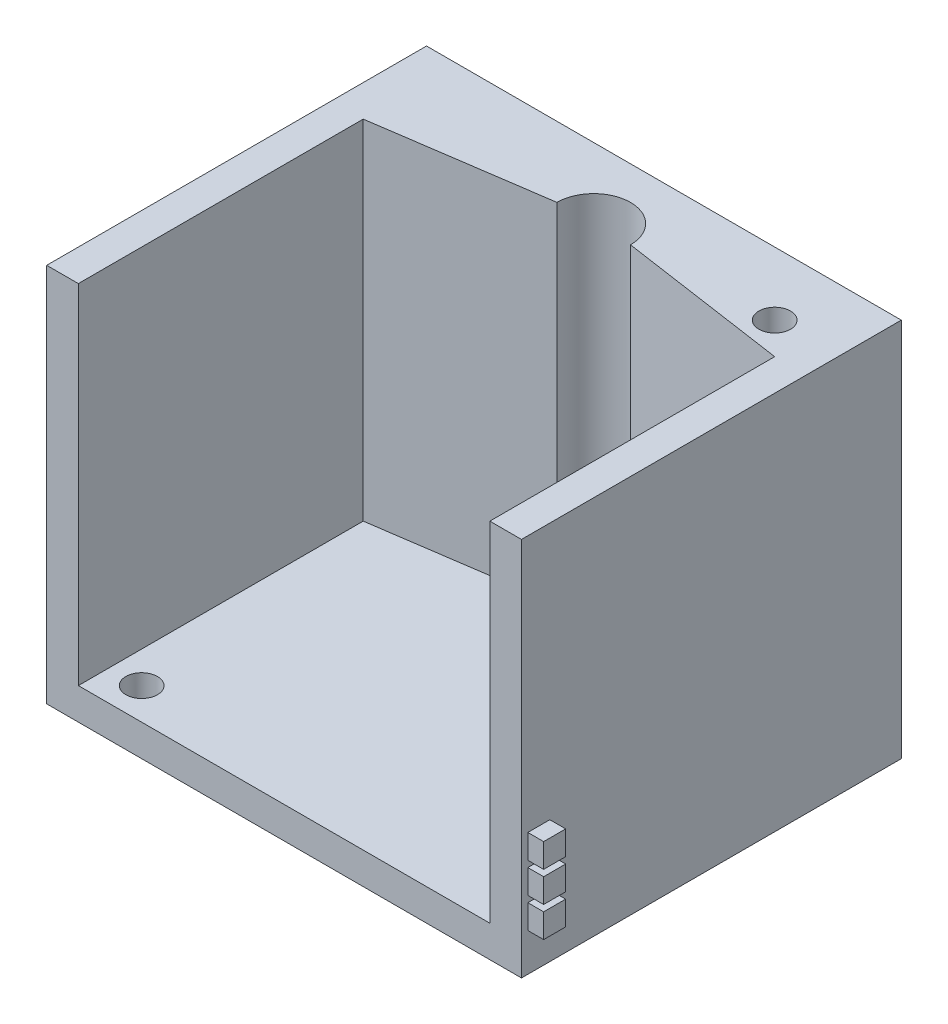
ISO-10303-21;
HEADER;
FILE_DESCRIPTION(('STEP AP214'),'2;1');
FILE_NAME('part.step','',(''),(''),'','','');
FILE_SCHEMA(('AUTOMOTIVE_DESIGN { 1 0 10303 214 1 1 1 1 }'));
ENDSEC;
DATA;
#1=APPLICATION_CONTEXT('core data for automotive mechanical design processes');
#2=APPLICATION_PROTOCOL_DEFINITION('international standard','automotive_design',2000,#1);
#3=PRODUCT_CONTEXT('',#1,'mechanical');
#4=PRODUCT('Part','Part','',(#3));
#5=PRODUCT_RELATED_PRODUCT_CATEGORY('part','',(#4));
#6=PRODUCT_DEFINITION_FORMATION('','',#4);
#7=PRODUCT_DEFINITION_CONTEXT('part definition',#1,'design');
#8=PRODUCT_DEFINITION('design','',#6,#7);
#9=PRODUCT_DEFINITION_SHAPE('','',#8);
#10=(LENGTH_UNIT() NAMED_UNIT(*) SI_UNIT(.MILLI.,.METRE.));
#11=(NAMED_UNIT(*) PLANE_ANGLE_UNIT() SI_UNIT($,.RADIAN.));
#12=(NAMED_UNIT(*) SI_UNIT($,.STERADIAN.) SOLID_ANGLE_UNIT());
#13=UNCERTAINTY_MEASURE_WITH_UNIT(LENGTH_MEASURE(1.E-05),#10,'distance_accuracy_value','');
#14=(GEOMETRIC_REPRESENTATION_CONTEXT(3) GLOBAL_UNCERTAINTY_ASSIGNED_CONTEXT((#13)) GLOBAL_UNIT_ASSIGNED_CONTEXT((#10,
#11,#12)) REPRESENTATION_CONTEXT('',''));
#15=CARTESIAN_POINT('',(0.,0.,0.));
#16=DIRECTION('',(0.,0.,1.));
#17=DIRECTION('',(1.,0.,0.));
#18=AXIS2_PLACEMENT_3D('',#15,#16,#17);
#19=CARTESIAN_POINT('',(150.,120.,0.));
#20=DIRECTION('',(-1.,0.,0.));
#21=DIRECTION('',(0.,0.,1.));
#22=AXIS2_PLACEMENT_3D('',#19,#20,#21);
#23=PLANE('',#22);
#24=DIRECTION('',(0.,-1.,0.));
#25=VECTOR('',#24,1.);
#26=CARTESIAN_POINT('',(150.,31.214997659939,-2.));
#27=LINE('',#26,#25);
#28=CARTESIAN_POINT('',(150.,38.8224964899084,-2.));
#29=VERTEX_POINT('',#28);
#30=CARTESIAN_POINT('',(150.,31.214997659939,-2.));
#31=VERTEX_POINT('',#30);
#32=EDGE_CURVE('E205',#29,#31,#27,.T.);
#33=ORIENTED_EDGE('',*,*,#32,.F.);
#34=DIRECTION('',(0.,0.,1.));
#35=VECTOR('',#34,1.);
#36=CARTESIAN_POINT('',(150.,38.8224964899084,-2.));
#37=LINE('',#36,#35);
#38=CARTESIAN_POINT('',(150.,38.8224964899084,-8.95989685133713));
#39=VERTEX_POINT('',#38);
#40=EDGE_CURVE('E218',#39,#29,#37,.T.);
#41=ORIENTED_EDGE('',*,*,#40,.F.);
#42=DIRECTION('',(0.,1.,0.));
#43=VECTOR('',#42,1.);
#44=CARTESIAN_POINT('',(150.,31.214997659939,-8.95989685133713));
#45=LINE('',#44,#43);
#46=CARTESIAN_POINT('',(150.,31.214997659939,-8.95989685133713));
#47=VERTEX_POINT('',#46);
#48=EDGE_CURVE('E227',#47,#39,#45,.T.);
#49=ORIENTED_EDGE('',*,*,#48,.F.);
#50=DIRECTION('',(0.,0.,-1.));
#51=VECTOR('',#50,1.);
#52=CARTESIAN_POINT('',(150.,31.214997659939,-2.));
#53=LINE('',#52,#51);
#54=EDGE_CURVE('E208',#31,#47,#53,.T.);
#55=ORIENTED_EDGE('',*,*,#54,.F.);
#56=EDGE_LOOP('',(#33,#41,#49,#55));
#57=FACE_BOUND('',#56,.T.);
#58=DIRECTION('',(0.,0.,-1.));
#59=VECTOR('',#58,1.);
#60=CARTESIAN_POINT('',(150.,0.,0.));
#61=LINE('',#60,#59);
#62=CARTESIAN_POINT('',(150.,0.,0.));
#63=VERTEX_POINT('',#62);
#64=CARTESIAN_POINT('',(150.,0.,-120.));
#65=VERTEX_POINT('',#64);
#66=EDGE_CURVE('E339',#63,#65,#61,.T.);
#67=ORIENTED_EDGE('',*,*,#66,.T.);
#68=DIRECTION('',(0.,-1.,0.));
#69=VECTOR('',#68,1.);
#70=CARTESIAN_POINT('',(150.,120.,-120.));
#71=LINE('',#70,#69);
#72=CARTESIAN_POINT('',(150.,120.,-120.));
#73=VERTEX_POINT('',#72);
#74=EDGE_CURVE('E344',#73,#65,#71,.T.);
#75=ORIENTED_EDGE('',*,*,#74,.F.);
#76=DIRECTION('',(0.,0.,-1.));
#77=VECTOR('',#76,1.);
#78=CARTESIAN_POINT('',(150.,120.,0.));
#79=LINE('',#78,#77);
#80=CARTESIAN_POINT('',(150.,120.,0.));
#81=VERTEX_POINT('',#80);
#82=EDGE_CURVE('E330',#81,#73,#79,.T.);
#83=ORIENTED_EDGE('',*,*,#82,.F.);
#84=DIRECTION('',(0.,-1.,0.));
#85=VECTOR('',#84,1.);
#86=CARTESIAN_POINT('',(150.,120.,0.));
#87=LINE('',#86,#85);
#88=EDGE_CURVE('E43',#81,#63,#87,.T.);
#89=ORIENTED_EDGE('',*,*,#88,.T.);
#90=EDGE_LOOP('',(#67,#75,#83,#89));
#91=FACE_BOUND('',#90,.T.);
#92=DIRECTION('',(0.,-1.,0.));
#93=VECTOR('',#92,1.);
#94=CARTESIAN_POINT('',(150.,12.,-2.));
#95=LINE('',#94,#93);
#96=CARTESIAN_POINT('',(150.,19.6074988299695,-2.));
#97=VERTEX_POINT('',#96);
#98=CARTESIAN_POINT('',(150.,12.,-2.));
#99=VERTEX_POINT('',#98);
#100=EDGE_CURVE('E243',#97,#99,#95,.T.);
#101=ORIENTED_EDGE('',*,*,#100,.F.);
#102=DIRECTION('',(0.,0.,1.));
#103=VECTOR('',#102,1.);
#104=CARTESIAN_POINT('',(150.,19.6074988299695,-2.));
#105=LINE('',#104,#103);
#106=CARTESIAN_POINT('',(150.,19.6074988299695,-8.95989685133713));
#107=VERTEX_POINT('',#106);
#108=EDGE_CURVE('E248',#107,#97,#105,.T.);
#109=ORIENTED_EDGE('',*,*,#108,.F.);
#110=DIRECTION('',(0.,1.,0.));
#111=VECTOR('',#110,1.);
#112=CARTESIAN_POINT('',(150.,12.,-8.95989685133713));
#113=LINE('',#112,#111);
#114=CARTESIAN_POINT('',(150.,12.,-8.95989685133713));
#115=VERTEX_POINT('',#114);
#116=EDGE_CURVE('E260',#115,#107,#113,.T.);
#117=ORIENTED_EDGE('',*,*,#116,.F.);
#118=DIRECTION('',(0.,0.,-1.));
#119=VECTOR('',#118,1.);
#120=CARTESIAN_POINT('',(150.,12.,-2.));
#121=LINE('',#120,#119);
#122=EDGE_CURVE('E257',#99,#115,#121,.T.);
#123=ORIENTED_EDGE('',*,*,#122,.F.);
#124=EDGE_LOOP('',(#101,#109,#117,#123));
#125=FACE_BOUND('',#124,.T.);
#126=DIRECTION('',(0.,-1.,0.));
#127=VECTOR('',#126,1.);
#128=CARTESIAN_POINT('',(150.,21.6074988299695,-2.));
#129=LINE('',#128,#127);
#130=CARTESIAN_POINT('',(150.,29.214997659939,-2.));
#131=VERTEX_POINT('',#130);
#132=CARTESIAN_POINT('',(150.,21.6074988299695,-2.));
#133=VERTEX_POINT('',#132);
#134=EDGE_CURVE('E204',#131,#133,#129,.T.);
#135=ORIENTED_EDGE('',*,*,#134,.F.);
#136=DIRECTION('',(0.,0.,1.));
#137=VECTOR('',#136,1.);
#138=CARTESIAN_POINT('',(150.,29.214997659939,-2.));
#139=LINE('',#138,#137);
#140=CARTESIAN_POINT('',(150.,29.214997659939,-8.95989685133713));
#141=VERTEX_POINT('',#140);
#142=EDGE_CURVE('E201',#141,#131,#139,.T.);
#143=ORIENTED_EDGE('',*,*,#142,.F.);
#144=DIRECTION('',(0.,1.,0.));
#145=VECTOR('',#144,1.);
#146=CARTESIAN_POINT('',(150.,21.6074988299695,-8.95989685133713));
#147=LINE('',#146,#145);
#148=CARTESIAN_POINT('',(150.,21.6074988299695,-8.95989685133713));
#149=VERTEX_POINT('',#148);
#150=EDGE_CURVE('E55',#149,#141,#147,.T.);
#151=ORIENTED_EDGE('',*,*,#150,.F.);
#152=DIRECTION('',(0.,0.,-1.));
#153=VECTOR('',#152,1.);
#154=CARTESIAN_POINT('',(150.,21.6074988299695,-2.));
#155=LINE('',#154,#153);
#156=EDGE_CURVE('E50',#133,#149,#155,.T.);
#157=ORIENTED_EDGE('',*,*,#156,.F.);
#158=EDGE_LOOP('',(#135,#143,#151,#157));
#159=FACE_BOUND('',#158,.T.);
#160=ADVANCED_FACE('F35',(#57,#91,#125,#159),#23,.F.);
#161=CARTESIAN_POINT('',(0.,10.,0.));
#162=DIRECTION('',(0.,-1.,0.));
#163=DIRECTION('',(0.,0.,-1.));
#164=AXIS2_PLACEMENT_3D('',#161,#162,#163);
#165=PLANE('',#164);
#166=CARTESIAN_POINT('',(20.,10.,-9.99999999999999));
#167=DIRECTION('',(0.,-1.,0.));
#168=DIRECTION('',(0.,0.,-1.));
#169=AXIS2_PLACEMENT_3D('',#166,#167,#168);
#170=CIRCLE('',#169,5.);
#171=CARTESIAN_POINT('',(20.,10.,-15.));
#172=VERTEX_POINT('',#171);
#173=EDGE_CURVE('E441',#172,#172,#170,.T.);
#174=ORIENTED_EDGE('',*,*,#173,.T.);
#175=EDGE_LOOP('',(#174));
#176=FACE_BOUND('',#175,.T.);
#177=DIRECTION('',(0.989442228077128,0.,0.144927834792937));
#178=VECTOR('',#177,1.);
#179=CARTESIAN_POINT('',(86.6160105092752,10.,-97.8193812533505));
#180=LINE('',#179,#178);
#181=CARTESIAN_POINT('',(86.6160105092752,9.99999999999999,-97.8193812533505));
#182=VERTEX_POINT('',#181);
#183=CARTESIAN_POINT('',(140.,10.,-90.));
#184=VERTEX_POINT('',#183);
#185=EDGE_CURVE('E289',#182,#184,#180,.T.);
#186=ORIENTED_EDGE('',*,*,#185,.F.);
#187=CARTESIAN_POINT('',(75.,10.,-97.8193812533506));
#188=DIRECTION('',(0.,-1.,0.));
#189=DIRECTION('',(0.,0.,1.));
#190=AXIS2_PLACEMENT_3D('',#187,#188,#189);
#191=CIRCLE('',#190,11.6160105092753);
#192=CARTESIAN_POINT('',(63.3839894907247,10.,-97.8193812533506));
#193=VERTEX_POINT('',#192);
#194=EDGE_CURVE('E276',#193,#182,#191,.T.);
#195=ORIENTED_EDGE('',*,*,#194,.F.);
#196=DIRECTION('',(0.989442228077127,0.,-0.14492783479294));
#197=VECTOR('',#196,1.);
#198=CARTESIAN_POINT('',(63.3839894907247,10.,-97.8193812533506));
#199=LINE('',#198,#197);
#200=CARTESIAN_POINT('',(10.,10.,-90.));
#201=VERTEX_POINT('',#200);
#202=EDGE_CURVE('E281',#201,#193,#199,.T.);
#203=ORIENTED_EDGE('',*,*,#202,.F.);
#204=DIRECTION('',(0.,0.,1.));
#205=VECTOR('',#204,1.);
#206=CARTESIAN_POINT('',(10.,10.,0.));
#207=LINE('',#206,#205);
#208=CARTESIAN_POINT('',(10.,10.,0.));
#209=VERTEX_POINT('',#208);
#210=EDGE_CURVE('E312',#201,#209,#207,.T.);
#211=ORIENTED_EDGE('',*,*,#210,.T.);
#212=DIRECTION('',(1.,0.,0.));
#213=VECTOR('',#212,1.);
#214=CARTESIAN_POINT('',(10.,10.,0.));
#215=LINE('',#214,#213);
#216=CARTESIAN_POINT('',(140.,10.,0.));
#217=VERTEX_POINT('',#216);
#218=EDGE_CURVE('E307',#209,#217,#215,.T.);
#219=ORIENTED_EDGE('',*,*,#218,.T.);
#220=DIRECTION('',(0.,0.,-1.));
#221=VECTOR('',#220,1.);
#222=CARTESIAN_POINT('',(140.,10.,0.));
#223=LINE('',#222,#221);
#224=EDGE_CURVE('E315',#217,#184,#223,.T.);
#225=ORIENTED_EDGE('',*,*,#224,.T.);
#226=EDGE_LOOP('',(#186,#195,#203,#211,#219,#225));
#227=FACE_BOUND('',#226,.T.);
#228=ADVANCED_FACE('F376',(#176,#227),#165,.F.);
#229=CARTESIAN_POINT('',(140.,-170.293863659264,0.));
#230=DIRECTION('',(1.,0.,0.));
#231=DIRECTION('',(0.,0.,-1.));
#232=AXIS2_PLACEMENT_3D('',#229,#230,#231);
#233=PLANE('',#232);
#234=DIRECTION('',(0.,-1.,0.));
#235=VECTOR('',#234,1.);
#236=CARTESIAN_POINT('',(140.,120.,-90.));
#237=LINE('',#236,#235);
#238=CARTESIAN_POINT('',(140.,120.,-90.));
#239=VERTEX_POINT('',#238);
#240=EDGE_CURVE('E299',#239,#184,#237,.T.);
#241=ORIENTED_EDGE('',*,*,#240,.T.);
#242=ORIENTED_EDGE('',*,*,#224,.F.);
#243=DIRECTION('',(0.,1.,0.));
#244=VECTOR('',#243,1.);
#245=CARTESIAN_POINT('',(140.,-170.293863659264,0.));
#246=LINE('',#245,#244);
#247=CARTESIAN_POINT('',(140.,120.,0.));
#248=VERTEX_POINT('',#247);
#249=EDGE_CURVE('E311',#217,#248,#246,.T.);
#250=ORIENTED_EDGE('',*,*,#249,.T.);
#251=DIRECTION('',(0.,0.,-1.));
#252=VECTOR('',#251,1.);
#253=CARTESIAN_POINT('',(140.,120.,0.));
#254=LINE('',#253,#252);
#255=EDGE_CURVE('E305',#248,#239,#254,.T.);
#256=ORIENTED_EDGE('',*,*,#255,.T.);
#257=EDGE_LOOP('',(#241,#242,#250,#256));
#258=FACE_BOUND('',#257,.T.);
#259=ADVANCED_FACE('F373',(#258),#233,.F.);
#260=CARTESIAN_POINT('',(10.,-170.293863659264,0.));
#261=DIRECTION('',(-1.,0.,0.));
#262=DIRECTION('',(0.,0.,1.));
#263=AXIS2_PLACEMENT_3D('',#260,#261,#262);
#264=PLANE('',#263);
#265=DIRECTION('',(0.,-1.,0.));
#266=VECTOR('',#265,1.);
#267=CARTESIAN_POINT('',(10.,120.,-90.));
#268=LINE('',#267,#266);
#269=CARTESIAN_POINT('',(10.,120.,-90.));
#270=VERTEX_POINT('',#269);
#271=EDGE_CURVE('E296',#270,#201,#268,.T.);
#272=ORIENTED_EDGE('',*,*,#271,.F.);
#273=DIRECTION('',(0.,0.,1.));
#274=VECTOR('',#273,1.);
#275=CARTESIAN_POINT('',(10.,120.,0.));
#276=LINE('',#275,#274);
#277=CARTESIAN_POINT('',(10.,120.,0.));
#278=VERTEX_POINT('',#277);
#279=EDGE_CURVE('E304',#270,#278,#276,.T.);
#280=ORIENTED_EDGE('',*,*,#279,.T.);
#281=DIRECTION('',(0.,1.,0.));
#282=VECTOR('',#281,1.);
#283=CARTESIAN_POINT('',(10.,-170.293863659264,0.));
#284=LINE('',#283,#282);
#285=EDGE_CURVE('E314',#209,#278,#284,.T.);
#286=ORIENTED_EDGE('',*,*,#285,.F.);
#287=ORIENTED_EDGE('',*,*,#210,.F.);
#288=EDGE_LOOP('',(#272,#280,#286,#287));
#289=FACE_BOUND('',#288,.T.);
#290=ADVANCED_FACE('F381',(#289),#264,.F.);
#291=CARTESIAN_POINT('',(0.,120.,0.));
#292=DIRECTION('',(1.,0.,0.));
#293=DIRECTION('',(0.,0.,-1.));
#294=AXIS2_PLACEMENT_3D('',#291,#292,#293);
#295=PLANE('',#294);
#296=DIRECTION('',(0.,0.,1.));
#297=VECTOR('',#296,1.);
#298=CARTESIAN_POINT('',(0.,0.,0.));
#299=LINE('',#298,#297);
#300=CARTESIAN_POINT('',(0.,0.,-120.));
#301=VERTEX_POINT('',#300);
#302=CARTESIAN_POINT('',(0.,0.,0.));
#303=VERTEX_POINT('',#302);
#304=EDGE_CURVE('E321',#301,#303,#299,.T.);
#305=ORIENTED_EDGE('',*,*,#304,.T.);
#306=DIRECTION('',(0.,-1.,0.));
#307=VECTOR('',#306,1.);
#308=CARTESIAN_POINT('',(0.,120.,0.));
#309=LINE('',#308,#307);
#310=CARTESIAN_POINT('',(0.,120.,0.));
#311=VERTEX_POINT('',#310);
#312=EDGE_CURVE('E12',#311,#303,#309,.T.);
#313=ORIENTED_EDGE('',*,*,#312,.F.);
#314=DIRECTION('',(0.,0.,1.));
#315=VECTOR('',#314,1.);
#316=CARTESIAN_POINT('',(0.,120.,0.));
#317=LINE('',#316,#315);
#318=CARTESIAN_POINT('',(0.,120.,-120.));
#319=VERTEX_POINT('',#318);
#320=EDGE_CURVE('E322',#319,#311,#317,.T.);
#321=ORIENTED_EDGE('',*,*,#320,.F.);
#322=DIRECTION('',(0.,-1.,0.));
#323=VECTOR('',#322,1.);
#324=CARTESIAN_POINT('',(0.,120.,-120.));
#325=LINE('',#324,#323);
#326=EDGE_CURVE('E334',#319,#301,#325,.T.);
#327=ORIENTED_EDGE('',*,*,#326,.T.);
#328=EDGE_LOOP('',(#305,#313,#321,#327));
#329=FACE_BOUND('',#328,.T.);
#330=ADVANCED_FACE('F37',(#329),#295,.F.);
#331=CARTESIAN_POINT('',(0.,120.,0.));
#332=DIRECTION('',(0.,0.,-1.));
#333=DIRECTION('',(-1.,0.,0.));
#334=AXIS2_PLACEMENT_3D('',#331,#332,#333);
#335=PLANE('',#334);
#336=DIRECTION('',(1.,0.,0.));
#337=VECTOR('',#336,1.);
#338=CARTESIAN_POINT('',(0.,120.,0.));
#339=LINE('',#338,#337);
#340=EDGE_CURVE('E325',#248,#81,#339,.T.);
#341=ORIENTED_EDGE('',*,*,#340,.F.);
#342=ORIENTED_EDGE('',*,*,#249,.F.);
#343=ORIENTED_EDGE('',*,*,#218,.F.);
#344=ORIENTED_EDGE('',*,*,#285,.T.);
#345=EDGE_CURVE('E327',#311,#278,#339,.T.);
#346=ORIENTED_EDGE('',*,*,#345,.F.);
#347=ORIENTED_EDGE('',*,*,#312,.T.);
#348=DIRECTION('',(1.,0.,0.));
#349=VECTOR('',#348,1.);
#350=CARTESIAN_POINT('',(0.,0.,0.));
#351=LINE('',#350,#349);
#352=EDGE_CURVE('E337',#303,#63,#351,.T.);
#353=ORIENTED_EDGE('',*,*,#352,.T.);
#354=ORIENTED_EDGE('',*,*,#88,.F.);
#355=EDGE_LOOP('',(#341,#342,#343,#344,#346,#347,#353,#354));
#356=FACE_BOUND('',#355,.T.);
#357=ADVANCED_FACE('F370',(#356),#335,.F.);
#358=CARTESIAN_POINT('',(0.,120.,-120.));
#359=DIRECTION('',(0.,0.,1.));
#360=DIRECTION('',(1.,0.,0.));
#361=AXIS2_PLACEMENT_3D('',#358,#359,#360);
#362=PLANE('',#361);
#363=DIRECTION('',(-1.,0.,0.));
#364=VECTOR('',#363,1.);
#365=CARTESIAN_POINT('',(0.,0.,-120.));
#366=LINE('',#365,#364);
#367=EDGE_CURVE('E326',#65,#301,#366,.T.);
#368=ORIENTED_EDGE('',*,*,#367,.T.);
#369=ORIENTED_EDGE('',*,*,#326,.F.);
#370=DIRECTION('',(-1.,0.,0.));
#371=VECTOR('',#370,1.);
#372=CARTESIAN_POINT('',(0.,120.,-120.));
#373=LINE('',#372,#371);
#374=EDGE_CURVE('E332',#73,#319,#373,.T.);
#375=ORIENTED_EDGE('',*,*,#374,.F.);
#376=ORIENTED_EDGE('',*,*,#74,.T.);
#377=EDGE_LOOP('',(#368,#369,#375,#376));
#378=FACE_BOUND('',#377,.T.);
#379=ADVANCED_FACE('F361',(#378),#362,.F.);
#380=CARTESIAN_POINT('',(0.,120.,0.));
#381=DIRECTION('',(0.,-1.,0.));
#382=DIRECTION('',(0.,0.,-1.));
#383=AXIS2_PLACEMENT_3D('',#380,#381,#382);
#384=PLANE('',#383);
#385=CARTESIAN_POINT('',(130.,120.,-100.));
#386=DIRECTION('',(0.,1.,0.));
#387=DIRECTION('',(0.,0.,1.));
#388=AXIS2_PLACEMENT_3D('',#385,#386,#387);
#389=CIRCLE('',#388,4.99999999999999);
#390=CARTESIAN_POINT('',(130.,120.,-95.));
#391=VERTEX_POINT('',#390);
#392=EDGE_CURVE('E439',#391,#391,#389,.T.);
#393=ORIENTED_EDGE('',*,*,#392,.F.);
#394=EDGE_LOOP('',(#393));
#395=FACE_BOUND('',#394,.T.);
#396=DIRECTION('',(0.989442228077128,0.,0.144927834792937));
#397=VECTOR('',#396,1.);
#398=CARTESIAN_POINT('',(86.6160105092752,120.,-97.8193812533505));
#399=LINE('',#398,#397);
#400=CARTESIAN_POINT('',(86.6160105092752,120.,-97.8193812533505));
#401=VERTEX_POINT('',#400);
#402=EDGE_CURVE('E280',#401,#239,#399,.T.);
#403=ORIENTED_EDGE('',*,*,#402,.T.);
#404=ORIENTED_EDGE('',*,*,#255,.F.);
#405=ORIENTED_EDGE('',*,*,#340,.T.);
#406=ORIENTED_EDGE('',*,*,#82,.T.);
#407=ORIENTED_EDGE('',*,*,#374,.T.);
#408=ORIENTED_EDGE('',*,*,#320,.T.);
#409=ORIENTED_EDGE('',*,*,#345,.T.);
#410=ORIENTED_EDGE('',*,*,#279,.F.);
#411=DIRECTION('',(0.989442228077127,0.,-0.14492783479294));
#412=VECTOR('',#411,1.);
#413=CARTESIAN_POINT('',(63.3839894907247,120.,-97.8193812533506));
#414=LINE('',#413,#412);
#415=CARTESIAN_POINT('',(63.3839894907247,120.,-97.8193812533506));
#416=VERTEX_POINT('',#415);
#417=EDGE_CURVE('E284',#270,#416,#414,.T.);
#418=ORIENTED_EDGE('',*,*,#417,.T.);
#419=CARTESIAN_POINT('',(75.,120.,-97.8193812533506));
#420=DIRECTION('',(0.,-1.,0.));
#421=DIRECTION('',(0.,0.,1.));
#422=AXIS2_PLACEMENT_3D('',#419,#420,#421);
#423=CIRCLE('',#422,11.6160105092753);
#424=EDGE_CURVE('E277',#416,#401,#423,.T.);
#425=ORIENTED_EDGE('',*,*,#424,.T.);
#426=EDGE_LOOP('',(#403,#404,#405,#406,#407,#408,#409,#410,#418,#425));
#427=FACE_BOUND('',#426,.T.);
#428=ADVANCED_FACE('F367',(#395,#427),#384,.F.);
#429=CARTESIAN_POINT('',(0.,0.,0.));
#430=DIRECTION('',(0.,-1.,0.));
#431=DIRECTION('',(0.,0.,-1.));
#432=AXIS2_PLACEMENT_3D('',#429,#430,#431);
#433=PLANE('',#432);
#434=CARTESIAN_POINT('',(20.,0.,-9.99999999999999));
#435=DIRECTION('',(0.,1.,0.));
#436=DIRECTION('',(0.,0.,1.));
#437=AXIS2_PLACEMENT_3D('',#434,#435,#436);
#438=CIRCLE('',#437,5.);
#439=CARTESIAN_POINT('',(20.,0.,-4.99999999999999));
#440=VERTEX_POINT('',#439);
#441=EDGE_CURVE('E434',#440,#440,#438,.T.);
#442=ORIENTED_EDGE('',*,*,#441,.T.);
#443=EDGE_LOOP('',(#442));
#444=FACE_BOUND('',#443,.T.);
#445=CARTESIAN_POINT('',(130.,0.,-100.));
#446=DIRECTION('',(0.,1.,0.));
#447=DIRECTION('',(0.,0.,1.));
#448=AXIS2_PLACEMENT_3D('',#445,#446,#447);
#449=CIRCLE('',#448,4.99999999999999);
#450=CARTESIAN_POINT('',(130.,0.,-95.));
#451=VERTEX_POINT('',#450);
#452=EDGE_CURVE('E437',#451,#451,#449,.T.);
#453=ORIENTED_EDGE('',*,*,#452,.T.);
#454=EDGE_LOOP('',(#453));
#455=FACE_BOUND('',#454,.T.);
#456=ORIENTED_EDGE('',*,*,#304,.F.);
#457=ORIENTED_EDGE('',*,*,#367,.F.);
#458=ORIENTED_EDGE('',*,*,#66,.F.);
#459=ORIENTED_EDGE('',*,*,#352,.F.);
#460=EDGE_LOOP('',(#456,#457,#458,#459));
#461=FACE_BOUND('',#460,.T.);
#462=ADVANCED_FACE('F358',(#444,#455,#461),#433,.T.);
#463=CARTESIAN_POINT('',(75.,120.,-97.8193812533506));
#464=DIRECTION('',(0.,-1.,0.));
#465=DIRECTION('',(0.,0.,-1.));
#466=AXIS2_PLACEMENT_3D('',#463,#464,#465);
#467=CYLINDRICAL_SURFACE('',#466,11.6160105092753);
#468=ORIENTED_EDGE('',*,*,#194,.T.);
#469=DIRECTION('',(0.,-1.,0.));
#470=VECTOR('',#469,1.);
#471=CARTESIAN_POINT('',(86.6160105092752,120.,-97.8193812533505));
#472=LINE('',#471,#470);
#473=EDGE_CURVE('E301',#401,#182,#472,.T.);
#474=ORIENTED_EDGE('',*,*,#473,.F.);
#475=ORIENTED_EDGE('',*,*,#424,.F.);
#476=DIRECTION('',(0.,-1.,0.));
#477=VECTOR('',#476,1.);
#478=CARTESIAN_POINT('',(63.3839894907247,120.,-97.8193812533506));
#479=LINE('',#478,#477);
#480=EDGE_CURVE('E286',#416,#193,#479,.T.);
#481=ORIENTED_EDGE('',*,*,#480,.T.);
#482=EDGE_LOOP('',(#468,#474,#475,#481));
#483=FACE_BOUND('',#482,.T.);
#484=ADVANCED_FACE('F389',(#483),#467,.F.);
#485=CARTESIAN_POINT('',(86.6160105092752,120.,-97.8193812533505));
#486=DIRECTION('',(0.144927834792937,0.,-0.989442228077128));
#487=DIRECTION('',(-0.989442228077128,0.,-0.144927834792937));
#488=AXIS2_PLACEMENT_3D('',#485,#486,#487);
#489=PLANE('',#488);
#490=ORIENTED_EDGE('',*,*,#185,.T.);
#491=ORIENTED_EDGE('',*,*,#240,.F.);
#492=ORIENTED_EDGE('',*,*,#402,.F.);
#493=ORIENTED_EDGE('',*,*,#473,.T.);
#494=EDGE_LOOP('',(#490,#491,#492,#493));
#495=FACE_BOUND('',#494,.T.);
#496=ADVANCED_FACE('F391',(#495),#489,.F.);
#497=CARTESIAN_POINT('',(63.3839894907247,120.,-97.8193812533506));
#498=DIRECTION('',(-0.14492783479294,0.,-0.989442228077128));
#499=DIRECTION('',(-0.989442228077128,0.,0.14492783479294));
#500=AXIS2_PLACEMENT_3D('',#497,#498,#499);
#501=PLANE('',#500);
#502=ORIENTED_EDGE('',*,*,#202,.T.);
#503=ORIENTED_EDGE('',*,*,#480,.F.);
#504=ORIENTED_EDGE('',*,*,#417,.F.);
#505=ORIENTED_EDGE('',*,*,#271,.T.);
#506=EDGE_LOOP('',(#502,#503,#504,#505));
#507=FACE_BOUND('',#506,.T.);
#508=ADVANCED_FACE('F387',(#507),#501,.F.);
#509=CARTESIAN_POINT('',(155.,12.,-2.));
#510=DIRECTION('',(0.,0.,-1.));
#511=DIRECTION('',(-1.,0.,0.));
#512=AXIS2_PLACEMENT_3D('',#509,#510,#511);
#513=PLANE('',#512);
#514=ORIENTED_EDGE('',*,*,#100,.T.);
#515=DIRECTION('',(-1.,0.,0.));
#516=VECTOR('',#515,1.);
#517=CARTESIAN_POINT('',(155.,12.,-2.));
#518=LINE('',#517,#516);
#519=CARTESIAN_POINT('',(155.,12.,-2.));
#520=VERTEX_POINT('',#519);
#521=EDGE_CURVE('E273',#520,#99,#518,.T.);
#522=ORIENTED_EDGE('',*,*,#521,.F.);
#523=DIRECTION('',(0.,-1.,0.));
#524=VECTOR('',#523,1.);
#525=CARTESIAN_POINT('',(155.,12.,-2.));
#526=LINE('',#525,#524);
#527=CARTESIAN_POINT('',(155.,19.6074988299695,-2.));
#528=VERTEX_POINT('',#527);
#529=EDGE_CURVE('E244',#528,#520,#526,.T.);
#530=ORIENTED_EDGE('',*,*,#529,.F.);
#531=DIRECTION('',(-1.,0.,0.));
#532=VECTOR('',#531,1.);
#533=CARTESIAN_POINT('',(155.,19.6074988299695,-2.));
#534=LINE('',#533,#532);
#535=EDGE_CURVE('E254',#528,#97,#534,.T.);
#536=ORIENTED_EDGE('',*,*,#535,.T.);
#537=EDGE_LOOP('',(#514,#522,#530,#536));
#538=FACE_BOUND('',#537,.T.);
#539=ADVANCED_FACE('F398',(#538),#513,.F.);
#540=CARTESIAN_POINT('',(155.,12.,-2.));
#541=DIRECTION('',(0.,1.,0.));
#542=DIRECTION('',(0.,0.,1.));
#543=AXIS2_PLACEMENT_3D('',#540,#541,#542);
#544=PLANE('',#543);
#545=ORIENTED_EDGE('',*,*,#122,.T.);
#546=DIRECTION('',(-1.,0.,0.));
#547=VECTOR('',#546,1.);
#548=CARTESIAN_POINT('',(155.,12.,-8.95989685133713));
#549=LINE('',#548,#547);
#550=CARTESIAN_POINT('',(155.,12.,-8.95989685133713));
#551=VERTEX_POINT('',#550);
#552=EDGE_CURVE('E270',#551,#115,#549,.T.);
#553=ORIENTED_EDGE('',*,*,#552,.F.);
#554=DIRECTION('',(0.,0.,-1.));
#555=VECTOR('',#554,1.);
#556=CARTESIAN_POINT('',(155.,12.,-2.));
#557=LINE('',#556,#555);
#558=EDGE_CURVE('E247',#520,#551,#557,.T.);
#559=ORIENTED_EDGE('',*,*,#558,.F.);
#560=ORIENTED_EDGE('',*,*,#521,.T.);
#561=EDGE_LOOP('',(#545,#553,#559,#560));
#562=FACE_BOUND('',#561,.T.);
#563=ADVANCED_FACE('F505',(#562),#544,.F.);
#564=CARTESIAN_POINT('',(155.,12.,-8.95989685133713));
#565=DIRECTION('',(0.,0.,1.));
#566=DIRECTION('',(1.,0.,0.));
#567=AXIS2_PLACEMENT_3D('',#564,#565,#566);
#568=PLANE('',#567);
#569=ORIENTED_EDGE('',*,*,#116,.T.);
#570=DIRECTION('',(-1.,0.,0.));
#571=VECTOR('',#570,1.);
#572=CARTESIAN_POINT('',(155.,19.6074988299695,-8.95989685133713));
#573=LINE('',#572,#571);
#574=CARTESIAN_POINT('',(155.,19.6074988299695,-8.95989685133713));
#575=VERTEX_POINT('',#574);
#576=EDGE_CURVE('E267',#575,#107,#573,.T.);
#577=ORIENTED_EDGE('',*,*,#576,.F.);
#578=DIRECTION('',(0.,1.,0.));
#579=VECTOR('',#578,1.);
#580=CARTESIAN_POINT('',(155.,12.,-8.95989685133713));
#581=LINE('',#580,#579);
#582=EDGE_CURVE('E250',#551,#575,#581,.T.);
#583=ORIENTED_EDGE('',*,*,#582,.F.);
#584=ORIENTED_EDGE('',*,*,#552,.T.);
#585=EDGE_LOOP('',(#569,#577,#583,#584));
#586=FACE_BOUND('',#585,.T.);
#587=ADVANCED_FACE('F501',(#586),#568,.F.);
#588=CARTESIAN_POINT('',(155.,19.6074988299695,-2.));
#589=DIRECTION('',(0.,-1.,0.));
#590=DIRECTION('',(0.,0.,-1.));
#591=AXIS2_PLACEMENT_3D('',#588,#589,#590);
#592=PLANE('',#591);
#593=ORIENTED_EDGE('',*,*,#108,.T.);
#594=ORIENTED_EDGE('',*,*,#535,.F.);
#595=DIRECTION('',(0.,0.,1.));
#596=VECTOR('',#595,1.);
#597=CARTESIAN_POINT('',(155.,19.6074988299695,-2.));
#598=LINE('',#597,#596);
#599=EDGE_CURVE('E252',#575,#528,#598,.T.);
#600=ORIENTED_EDGE('',*,*,#599,.F.);
#601=ORIENTED_EDGE('',*,*,#576,.T.);
#602=EDGE_LOOP('',(#593,#594,#600,#601));
#603=FACE_BOUND('',#602,.T.);
#604=ADVANCED_FACE('F497',(#603),#592,.F.);
#605=CARTESIAN_POINT('',(155.,0.,0.));
#606=DIRECTION('',(-1.,0.,0.));
#607=DIRECTION('',(0.,0.,1.));
#608=AXIS2_PLACEMENT_3D('',#605,#606,#607);
#609=PLANE('',#608);
#610=ORIENTED_EDGE('',*,*,#529,.T.);
#611=ORIENTED_EDGE('',*,*,#558,.T.);
#612=ORIENTED_EDGE('',*,*,#582,.T.);
#613=ORIENTED_EDGE('',*,*,#599,.T.);
#614=EDGE_LOOP('',(#610,#611,#612,#613));
#615=FACE_BOUND('',#614,.T.);
#616=ADVANCED_FACE('F493',(#615),#609,.F.);
#617=CARTESIAN_POINT('',(155.,31.214997659939,-2.));
#618=DIRECTION('',(0.,0.,-1.));
#619=DIRECTION('',(-1.,0.,0.));
#620=AXIS2_PLACEMENT_3D('',#617,#618,#619);
#621=PLANE('',#620);
#622=ORIENTED_EDGE('',*,*,#32,.T.);
#623=DIRECTION('',(-1.,0.,0.));
#624=VECTOR('',#623,1.);
#625=CARTESIAN_POINT('',(155.,31.214997659939,-2.));
#626=LINE('',#625,#624);
#627=CARTESIAN_POINT('',(155.,31.214997659939,-2.));
#628=VERTEX_POINT('',#627);
#629=EDGE_CURVE('E240',#628,#31,#626,.T.);
#630=ORIENTED_EDGE('',*,*,#629,.F.);
#631=DIRECTION('',(0.,-1.,0.));
#632=VECTOR('',#631,1.);
#633=CARTESIAN_POINT('',(155.,31.214997659939,-2.));
#634=LINE('',#633,#632);
#635=CARTESIAN_POINT('',(155.,38.8224964899084,-2.));
#636=VERTEX_POINT('',#635);
#637=EDGE_CURVE('E214',#636,#628,#634,.T.);
#638=ORIENTED_EDGE('',*,*,#637,.F.);
#639=DIRECTION('',(-1.,0.,0.));
#640=VECTOR('',#639,1.);
#641=CARTESIAN_POINT('',(155.,38.8224964899084,-2.));
#642=LINE('',#641,#640);
#643=EDGE_CURVE('E223',#636,#29,#642,.T.);
#644=ORIENTED_EDGE('',*,*,#643,.T.);
#645=EDGE_LOOP('',(#622,#630,#638,#644));
#646=FACE_BOUND('',#645,.T.);
#647=ADVANCED_FACE('F489',(#646),#621,.F.);
#648=CARTESIAN_POINT('',(155.,31.214997659939,-2.));
#649=DIRECTION('',(0.,1.,0.));
#650=DIRECTION('',(0.,0.,1.));
#651=AXIS2_PLACEMENT_3D('',#648,#649,#650);
#652=PLANE('',#651);
#653=ORIENTED_EDGE('',*,*,#54,.T.);
#654=DIRECTION('',(-1.,0.,0.));
#655=VECTOR('',#654,1.);
#656=CARTESIAN_POINT('',(155.,31.214997659939,-8.95989685133713));
#657=LINE('',#656,#655);
#658=CARTESIAN_POINT('',(155.,31.214997659939,-8.95989685133713));
#659=VERTEX_POINT('',#658);
#660=EDGE_CURVE('E237',#659,#47,#657,.T.);
#661=ORIENTED_EDGE('',*,*,#660,.F.);
#662=DIRECTION('',(0.,0.,-1.));
#663=VECTOR('',#662,1.);
#664=CARTESIAN_POINT('',(155.,31.214997659939,-2.));
#665=LINE('',#664,#663);
#666=EDGE_CURVE('E217',#628,#659,#665,.T.);
#667=ORIENTED_EDGE('',*,*,#666,.F.);
#668=ORIENTED_EDGE('',*,*,#629,.T.);
#669=EDGE_LOOP('',(#653,#661,#667,#668));
#670=FACE_BOUND('',#669,.T.);
#671=ADVANCED_FACE('F485',(#670),#652,.F.);
#672=CARTESIAN_POINT('',(155.,31.214997659939,-8.95989685133713));
#673=DIRECTION('',(0.,0.,1.));
#674=DIRECTION('',(1.,0.,0.));
#675=AXIS2_PLACEMENT_3D('',#672,#673,#674);
#676=PLANE('',#675);
#677=ORIENTED_EDGE('',*,*,#48,.T.);
#678=DIRECTION('',(-1.,0.,0.));
#679=VECTOR('',#678,1.);
#680=CARTESIAN_POINT('',(155.,38.8224964899084,-8.95989685133713));
#681=LINE('',#680,#679);
#682=CARTESIAN_POINT('',(155.,38.8224964899084,-8.95989685133713));
#683=VERTEX_POINT('',#682);
#684=EDGE_CURVE('E234',#683,#39,#681,.T.);
#685=ORIENTED_EDGE('',*,*,#684,.F.);
#686=DIRECTION('',(0.,1.,0.));
#687=VECTOR('',#686,1.);
#688=CARTESIAN_POINT('',(155.,31.214997659939,-8.95989685133713));
#689=LINE('',#688,#687);
#690=EDGE_CURVE('E220',#659,#683,#689,.T.);
#691=ORIENTED_EDGE('',*,*,#690,.F.);
#692=ORIENTED_EDGE('',*,*,#660,.T.);
#693=EDGE_LOOP('',(#677,#685,#691,#692));
#694=FACE_BOUND('',#693,.T.);
#695=ADVANCED_FACE('F481',(#694),#676,.F.);
#696=CARTESIAN_POINT('',(155.,38.8224964899084,-2.));
#697=DIRECTION('',(0.,-1.,0.));
#698=DIRECTION('',(0.,0.,-1.));
#699=AXIS2_PLACEMENT_3D('',#696,#697,#698);
#700=PLANE('',#699);
#701=ORIENTED_EDGE('',*,*,#40,.T.);
#702=ORIENTED_EDGE('',*,*,#643,.F.);
#703=DIRECTION('',(0.,0.,1.));
#704=VECTOR('',#703,1.);
#705=CARTESIAN_POINT('',(155.,38.8224964899084,-2.));
#706=LINE('',#705,#704);
#707=EDGE_CURVE('E222',#683,#636,#706,.T.);
#708=ORIENTED_EDGE('',*,*,#707,.F.);
#709=ORIENTED_EDGE('',*,*,#684,.T.);
#710=EDGE_LOOP('',(#701,#702,#708,#709));
#711=FACE_BOUND('',#710,.T.);
#712=ADVANCED_FACE('F477',(#711),#700,.F.);
#713=CARTESIAN_POINT('',(155.,0.,0.));
#714=DIRECTION('',(-1.,0.,0.));
#715=DIRECTION('',(0.,0.,1.));
#716=AXIS2_PLACEMENT_3D('',#713,#714,#715);
#717=PLANE('',#716);
#718=ORIENTED_EDGE('',*,*,#637,.T.);
#719=ORIENTED_EDGE('',*,*,#666,.T.);
#720=ORIENTED_EDGE('',*,*,#690,.T.);
#721=ORIENTED_EDGE('',*,*,#707,.T.);
#722=EDGE_LOOP('',(#718,#719,#720,#721));
#723=FACE_BOUND('',#722,.T.);
#724=ADVANCED_FACE('F474',(#723),#717,.F.);
#725=CARTESIAN_POINT('',(155.,21.6074988299695,-2.));
#726=DIRECTION('',(0.,0.,-1.));
#727=DIRECTION('',(-1.,0.,0.));
#728=AXIS2_PLACEMENT_3D('',#725,#726,#727);
#729=PLANE('',#728);
#730=ORIENTED_EDGE('',*,*,#134,.T.);
#731=DIRECTION('',(-1.,0.,0.));
#732=VECTOR('',#731,1.);
#733=CARTESIAN_POINT('',(155.,21.6074988299695,-2.));
#734=LINE('',#733,#732);
#735=CARTESIAN_POINT('',(155.,21.6074988299695,-2.));
#736=VERTEX_POINT('',#735);
#737=EDGE_CURVE('E185',#736,#133,#734,.T.);
#738=ORIENTED_EDGE('',*,*,#737,.F.);
#739=DIRECTION('',(0.,-1.,0.));
#740=VECTOR('',#739,1.);
#741=CARTESIAN_POINT('',(155.,21.6074988299695,-2.));
#742=LINE('',#741,#740);
#743=CARTESIAN_POINT('',(155.,29.214997659939,-2.));
#744=VERTEX_POINT('',#743);
#745=EDGE_CURVE('E192',#744,#736,#742,.T.);
#746=ORIENTED_EDGE('',*,*,#745,.F.);
#747=DIRECTION('',(-1.,0.,0.));
#748=VECTOR('',#747,1.);
#749=CARTESIAN_POINT('',(155.,29.214997659939,-2.));
#750=LINE('',#749,#748);
#751=EDGE_CURVE('E450',#744,#131,#750,.T.);
#752=ORIENTED_EDGE('',*,*,#751,.T.);
#753=EDGE_LOOP('',(#730,#738,#746,#752));
#754=FACE_BOUND('',#753,.T.);
#755=ADVANCED_FACE('F203',(#754),#729,.F.);
#756=CARTESIAN_POINT('',(155.,21.6074988299695,-2.));
#757=DIRECTION('',(0.,1.,0.));
#758=DIRECTION('',(0.,0.,1.));
#759=AXIS2_PLACEMENT_3D('',#756,#757,#758);
#760=PLANE('',#759);
#761=ORIENTED_EDGE('',*,*,#156,.T.);
#762=DIRECTION('',(-1.,0.,0.));
#763=VECTOR('',#762,1.);
#764=CARTESIAN_POINT('',(155.,21.6074988299695,-8.95989685133713));
#765=LINE('',#764,#763);
#766=CARTESIAN_POINT('',(155.,21.6074988299695,-8.95989685133713));
#767=VERTEX_POINT('',#766);
#768=EDGE_CURVE('E188',#767,#149,#765,.T.);
#769=ORIENTED_EDGE('',*,*,#768,.F.);
#770=DIRECTION('',(0.,0.,-1.));
#771=VECTOR('',#770,1.);
#772=CARTESIAN_POINT('',(155.,21.6074988299695,-2.));
#773=LINE('',#772,#771);
#774=EDGE_CURVE('E181',#736,#767,#773,.T.);
#775=ORIENTED_EDGE('',*,*,#774,.F.);
#776=ORIENTED_EDGE('',*,*,#737,.T.);
#777=EDGE_LOOP('',(#761,#769,#775,#776));
#778=FACE_BOUND('',#777,.T.);
#779=ADVANCED_FACE('F183',(#778),#760,.F.);
#780=CARTESIAN_POINT('',(155.,21.6074988299695,-8.95989685133713));
#781=DIRECTION('',(0.,0.,1.));
#782=DIRECTION('',(1.,0.,0.));
#783=AXIS2_PLACEMENT_3D('',#780,#781,#782);
#784=PLANE('',#783);
#785=ORIENTED_EDGE('',*,*,#150,.T.);
#786=DIRECTION('',(-1.,0.,0.));
#787=VECTOR('',#786,1.);
#788=CARTESIAN_POINT('',(155.,29.214997659939,-8.95989685133713));
#789=LINE('',#788,#787);
#790=CARTESIAN_POINT('',(155.,29.214997659939,-8.95989685133713));
#791=VERTEX_POINT('',#790);
#792=EDGE_CURVE('E210',#791,#141,#789,.T.);
#793=ORIENTED_EDGE('',*,*,#792,.F.);
#794=DIRECTION('',(0.,1.,0.));
#795=VECTOR('',#794,1.);
#796=CARTESIAN_POINT('',(155.,21.6074988299695,-8.95989685133713));
#797=LINE('',#796,#795);
#798=EDGE_CURVE('E191',#767,#791,#797,.T.);
#799=ORIENTED_EDGE('',*,*,#798,.F.);
#800=ORIENTED_EDGE('',*,*,#768,.T.);
#801=EDGE_LOOP('',(#785,#793,#799,#800));
#802=FACE_BOUND('',#801,.T.);
#803=ADVANCED_FACE('F461',(#802),#784,.F.);
#804=CARTESIAN_POINT('',(155.,29.214997659939,-2.));
#805=DIRECTION('',(0.,-1.,0.));
#806=DIRECTION('',(0.,0.,-1.));
#807=AXIS2_PLACEMENT_3D('',#804,#805,#806);
#808=PLANE('',#807);
#809=ORIENTED_EDGE('',*,*,#142,.T.);
#810=ORIENTED_EDGE('',*,*,#751,.F.);
#811=DIRECTION('',(0.,0.,1.));
#812=VECTOR('',#811,1.);
#813=CARTESIAN_POINT('',(155.,29.214997659939,-2.));
#814=LINE('',#813,#812);
#815=EDGE_CURVE('E197',#791,#744,#814,.T.);
#816=ORIENTED_EDGE('',*,*,#815,.F.);
#817=ORIENTED_EDGE('',*,*,#792,.T.);
#818=EDGE_LOOP('',(#809,#810,#816,#817));
#819=FACE_BOUND('',#818,.T.);
#820=ADVANCED_FACE('F459',(#819),#808,.F.);
#821=CARTESIAN_POINT('',(155.,0.,0.));
#822=DIRECTION('',(-1.,0.,0.));
#823=DIRECTION('',(0.,0.,1.));
#824=AXIS2_PLACEMENT_3D('',#821,#822,#823);
#825=PLANE('',#824);
#826=ORIENTED_EDGE('',*,*,#745,.T.);
#827=ORIENTED_EDGE('',*,*,#774,.T.);
#828=ORIENTED_EDGE('',*,*,#798,.T.);
#829=ORIENTED_EDGE('',*,*,#815,.T.);
#830=EDGE_LOOP('',(#826,#827,#828,#829));
#831=FACE_BOUND('',#830,.T.);
#832=ADVANCED_FACE('F195',(#831),#825,.F.);
#833=CARTESIAN_POINT('',(130.,0.,-100.));
#834=DIRECTION('',(0.,1.,0.));
#835=DIRECTION('',(0.,0.,1.));
#836=AXIS2_PLACEMENT_3D('',#833,#834,#835);
#837=CYLINDRICAL_SURFACE('',#836,4.99999999999999);
#838=ORIENTED_EDGE('',*,*,#452,.F.);
#839=EDGE_LOOP('',(#838));
#840=FACE_BOUND('',#839,.T.);
#841=ORIENTED_EDGE('',*,*,#392,.T.);
#842=EDGE_LOOP('',(#841));
#843=FACE_BOUND('',#842,.T.);
#844=ADVANCED_FACE('F586',(#840,#843),#837,.F.);
#845=CARTESIAN_POINT('',(20.,0.,-9.99999999999999));
#846=DIRECTION('',(0.,1.,0.));
#847=DIRECTION('',(0.,0.,1.));
#848=AXIS2_PLACEMENT_3D('',#845,#846,#847);
#849=CYLINDRICAL_SURFACE('',#848,5.);
#850=ORIENTED_EDGE('',*,*,#441,.F.);
#851=EDGE_LOOP('',(#850));
#852=FACE_BOUND('',#851,.T.);
#853=ORIENTED_EDGE('',*,*,#173,.F.);
#854=EDGE_LOOP('',(#853));
#855=FACE_BOUND('',#854,.T.);
#856=ADVANCED_FACE('F614',(#852,#855),#849,.F.);
#857=CLOSED_SHELL('',(#160,#228,#259,#290,#330,#357,#379,#428,#462,#484,#496,#508,#539,#563,
#587,#604,#616,#647,#671,#695,#712,#724,#755,#779,#803,#820,#832,#844,#856));
#858=MANIFOLD_SOLID_BREP('B2',#857);
#859=ADVANCED_BREP_SHAPE_REPRESENTATION('',(#18,#858),#14);
#860=SHAPE_DEFINITION_REPRESENTATION(#9,#859);
ENDSEC;
END-ISO-10303-21;
